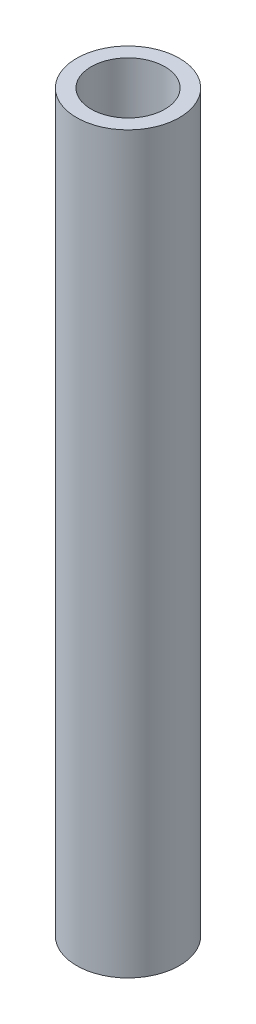
ISO-10303-21;
HEADER;
FILE_DESCRIPTION(('STEP AP214'),'2;1');
FILE_NAME('part.step','',(''),(''),'','','');
FILE_SCHEMA(('AUTOMOTIVE_DESIGN { 1 0 10303 214 1 1 1 1 }'));
ENDSEC;
DATA;
#1=APPLICATION_CONTEXT('core data for automotive mechanical design processes');
#2=APPLICATION_PROTOCOL_DEFINITION('international standard','automotive_design',2000,#1);
#3=PRODUCT_CONTEXT('',#1,'mechanical');
#4=PRODUCT('Part','Part','',(#3));
#5=PRODUCT_RELATED_PRODUCT_CATEGORY('part','',(#4));
#6=PRODUCT_DEFINITION_FORMATION('','',#4);
#7=PRODUCT_DEFINITION_CONTEXT('part definition',#1,'design');
#8=PRODUCT_DEFINITION('design','',#6,#7);
#9=PRODUCT_DEFINITION_SHAPE('','',#8);
#10=(LENGTH_UNIT() NAMED_UNIT(*) SI_UNIT(.MILLI.,.METRE.));
#11=(NAMED_UNIT(*) PLANE_ANGLE_UNIT() SI_UNIT($,.RADIAN.));
#12=(NAMED_UNIT(*) SI_UNIT($,.STERADIAN.) SOLID_ANGLE_UNIT());
#13=UNCERTAINTY_MEASURE_WITH_UNIT(LENGTH_MEASURE(1.E-05),#10,'distance_accuracy_value','');
#14=(GEOMETRIC_REPRESENTATION_CONTEXT(3) GLOBAL_UNCERTAINTY_ASSIGNED_CONTEXT((#13)) GLOBAL_UNIT_ASSIGNED_CONTEXT((#10,
#11,#12)) REPRESENTATION_CONTEXT('',''));
#15=CARTESIAN_POINT('',(0.,0.,0.));
#16=DIRECTION('',(0.,0.,1.));
#17=DIRECTION('',(1.,0.,0.));
#18=AXIS2_PLACEMENT_3D('',#15,#16,#17);
#19=CARTESIAN_POINT('',(0.,152.4,0.));
#20=DIRECTION('',(0.,1.,0.));
#21=DIRECTION('',(0.,0.,1.));
#22=AXIS2_PLACEMENT_3D('',#19,#20,#21);
#23=PLANE('',#22);
#24=CARTESIAN_POINT('',(0.,152.4,0.));
#25=DIRECTION('',(0.,1.,0.));
#26=DIRECTION('',(0.,0.,1.));
#27=AXIS2_PLACEMENT_3D('',#24,#25,#26);
#28=CIRCLE('',#27,10.668);
#29=CARTESIAN_POINT('',(0.,152.4,-10.668));
#30=VERTEX_POINT('',#29);
#31=EDGE_CURVE('E10',#30,#30,#28,.T.);
#32=ORIENTED_EDGE('',*,*,#31,.T.);
#33=EDGE_LOOP('',(#32));
#34=FACE_BOUND('',#33,.T.);
#35=CARTESIAN_POINT('',(0.,152.4,0.));
#36=DIRECTION('',(0.,1.,0.));
#37=DIRECTION('',(0.,0.,1.));
#38=AXIS2_PLACEMENT_3D('',#35,#36,#37);
#39=CIRCLE('',#38,7.6454);
#40=CARTESIAN_POINT('',(0.,152.4,-7.6454));
#41=VERTEX_POINT('',#40);
#42=EDGE_CURVE('E42',#41,#41,#39,.T.);
#43=ORIENTED_EDGE('',*,*,#42,.F.);
#44=EDGE_LOOP('',(#43));
#45=FACE_BOUND('',#44,.T.);
#46=ADVANCED_FACE('F31',(#34,#45),#23,.T.);
#47=CARTESIAN_POINT('',(0.,0.,0.));
#48=DIRECTION('',(0.,1.,0.));
#49=DIRECTION('',(0.,0.,1.));
#50=AXIS2_PLACEMENT_3D('',#47,#48,#49);
#51=PLANE('',#50);
#52=CARTESIAN_POINT('',(0.,0.,0.));
#53=DIRECTION('',(0.,1.,0.));
#54=DIRECTION('',(0.,0.,1.));
#55=AXIS2_PLACEMENT_3D('',#52,#53,#54);
#56=CIRCLE('',#55,10.668);
#57=CARTESIAN_POINT('',(0.,0.,-10.668));
#58=VERTEX_POINT('',#57);
#59=EDGE_CURVE('E35',#58,#58,#56,.T.);
#60=ORIENTED_EDGE('',*,*,#59,.F.);
#61=EDGE_LOOP('',(#60));
#62=FACE_BOUND('',#61,.T.);
#63=CARTESIAN_POINT('',(0.,0.,0.));
#64=DIRECTION('',(0.,1.,0.));
#65=DIRECTION('',(0.,0.,1.));
#66=AXIS2_PLACEMENT_3D('',#63,#64,#65);
#67=CIRCLE('',#66,7.6454);
#68=CARTESIAN_POINT('',(0.,0.,-7.6454));
#69=VERTEX_POINT('',#68);
#70=EDGE_CURVE('E44',#69,#69,#67,.T.);
#71=ORIENTED_EDGE('',*,*,#70,.T.);
#72=EDGE_LOOP('',(#71));
#73=FACE_BOUND('',#72,.T.);
#74=ADVANCED_FACE('F54',(#62,#73),#51,.F.);
#75=CARTESIAN_POINT('',(0.,152.4,0.));
#76=DIRECTION('',(0.,-1.,0.));
#77=DIRECTION('',(0.,0.,-1.));
#78=AXIS2_PLACEMENT_3D('',#75,#76,#77);
#79=CYLINDRICAL_SURFACE('',#78,10.668);
#80=CARTESIAN_POINT('',(0.,152.4,-10.668));
#81=CARTESIAN_POINT('',(0.,150.8125,-10.668));
#82=CARTESIAN_POINT('',(0.,149.225,-10.668));
#83=CARTESIAN_POINT('',(0.,146.05,-10.668));
#84=CARTESIAN_POINT('',(0.,144.4625,-10.668));
#85=CARTESIAN_POINT('',(0.,141.2875,-10.668));
#86=CARTESIAN_POINT('',(0.,139.7,-10.668));
#87=CARTESIAN_POINT('',(0.,136.525,-10.668));
#88=CARTESIAN_POINT('',(0.,134.9375,-10.668));
#89=CARTESIAN_POINT('',(0.,131.7625,-10.668));
#90=CARTESIAN_POINT('',(0.,130.175,-10.668));
#91=CARTESIAN_POINT('',(0.,127.,-10.668));
#92=CARTESIAN_POINT('',(0.,125.4125,-10.668));
#93=CARTESIAN_POINT('',(0.,122.2375,-10.668));
#94=CARTESIAN_POINT('',(0.,120.65,-10.668));
#95=CARTESIAN_POINT('',(0.,117.475,-10.668));
#96=CARTESIAN_POINT('',(0.,115.8875,-10.668));
#97=CARTESIAN_POINT('',(0.,112.7125,-10.668));
#98=CARTESIAN_POINT('',(0.,111.125,-10.668));
#99=CARTESIAN_POINT('',(0.,107.95,-10.668));
#100=CARTESIAN_POINT('',(0.,106.3625,-10.668));
#101=CARTESIAN_POINT('',(0.,103.1875,-10.668));
#102=CARTESIAN_POINT('',(0.,101.6,-10.668));
#103=CARTESIAN_POINT('',(0.,98.425,-10.668));
#104=CARTESIAN_POINT('',(0.,96.8375,-10.668));
#105=CARTESIAN_POINT('',(0.,93.6625,-10.668));
#106=CARTESIAN_POINT('',(0.,92.075,-10.668));
#107=CARTESIAN_POINT('',(0.,88.9,-10.668));
#108=CARTESIAN_POINT('',(0.,87.3125,-10.668));
#109=CARTESIAN_POINT('',(0.,84.1375,-10.668));
#110=CARTESIAN_POINT('',(0.,82.55,-10.668));
#111=CARTESIAN_POINT('',(0.,79.375,-10.668));
#112=CARTESIAN_POINT('',(0.,77.7875,-10.668));
#113=CARTESIAN_POINT('',(0.,74.6125,-10.668));
#114=CARTESIAN_POINT('',(0.,73.025,-10.668));
#115=CARTESIAN_POINT('',(0.,69.85,-10.668));
#116=CARTESIAN_POINT('',(0.,68.2625,-10.668));
#117=CARTESIAN_POINT('',(0.,65.0875,-10.668));
#118=CARTESIAN_POINT('',(0.,63.5,-10.668));
#119=CARTESIAN_POINT('',(0.,60.325,-10.668));
#120=CARTESIAN_POINT('',(0.,58.7375,-10.668));
#121=CARTESIAN_POINT('',(0.,55.5625,-10.668));
#122=CARTESIAN_POINT('',(0.,53.975,-10.668));
#123=CARTESIAN_POINT('',(0.,50.8,-10.668));
#124=CARTESIAN_POINT('',(0.,49.2125,-10.668));
#125=CARTESIAN_POINT('',(0.,46.0375,-10.668));
#126=CARTESIAN_POINT('',(0.,44.45,-10.668));
#127=CARTESIAN_POINT('',(0.,41.275,-10.668));
#128=CARTESIAN_POINT('',(0.,39.6875,-10.668));
#129=CARTESIAN_POINT('',(0.,36.5125,-10.668));
#130=CARTESIAN_POINT('',(0.,34.925,-10.668));
#131=CARTESIAN_POINT('',(0.,31.75,-10.668));
#132=CARTESIAN_POINT('',(0.,30.1625,-10.668));
#133=CARTESIAN_POINT('',(0.,26.9875,-10.668));
#134=CARTESIAN_POINT('',(0.,25.4,-10.668));
#135=CARTESIAN_POINT('',(0.,22.225,-10.668));
#136=CARTESIAN_POINT('',(0.,20.6375,-10.668));
#137=CARTESIAN_POINT('',(0.,17.4625,-10.668));
#138=CARTESIAN_POINT('',(0.,15.875,-10.668));
#139=CARTESIAN_POINT('',(0.,12.7,-10.668));
#140=CARTESIAN_POINT('',(0.,11.1125,-10.668));
#141=CARTESIAN_POINT('',(0.,7.93750000000001,-10.668));
#142=CARTESIAN_POINT('',(0.,6.35,-10.668));
#143=CARTESIAN_POINT('',(0.,3.175,-10.668));
#144=CARTESIAN_POINT('',(0.,1.5875,-10.668));
#145=CARTESIAN_POINT('',(0.,0.,-10.668));
#146=B_SPLINE_CURVE_WITH_KNOTS('',3,(#80,#81,#82,#83,#84,#85,#86,#87,#88,#89,#90,#91,#92,#93,
#94,#95,#96,#97,#98,#99,#100,#101,#102,#103,#104,#105,#106,#107,#108,#109,#110,#111,#112,#113,
#114,#115,#116,#117,#118,#119,#120,#121,#122,#123,#124,#125,#126,#127,#128,#129,#130,#131,#132,
#133,#134,#135,#136,#137,#138,#139,#140,#141,#142,#143,#144,#145),.UNSPECIFIED.,.F.,.F.,(4,2,2,
2,2,2,2,2,2,2,2,2,2,2,2,2,2,2,2,2,2,2,2,2,2,2,2,2,2,2,2,2,4),(0.,4.76249999999998,
9.52499999999998,14.2875,19.05,23.8125,28.575,33.3375,38.1,42.8625,47.625,52.3875,57.15,61.9125,
66.675,71.4375,76.2,80.9625,85.725,90.4875,95.25,100.0125,104.775,109.5375,114.3,119.0625,
123.825,128.5875,133.35,138.1125,142.875,147.6375,152.4),.UNSPECIFIED.);
#147=EDGE_CURVE('BSEAM33',#30,#58,#146,.T.);
#148=ORIENTED_EDGE('',*,*,#31,.F.);
#149=ORIENTED_EDGE('',*,*,#59,.T.);
#150=ORIENTED_EDGE('',*,*,#147,.T.);
#151=ORIENTED_EDGE('',*,*,#147,.F.);
#152=EDGE_LOOP('',(#148,#150,#149,#151));
#153=FACE_BOUND('',#152,.T.);
#154=ADVANCED_FACE('F33',(#153),#79,.T.);
#155=CARTESIAN_POINT('',(0.,152.4,0.));
#156=DIRECTION('',(0.,-1.,0.));
#157=DIRECTION('',(0.,0.,-1.));
#158=AXIS2_PLACEMENT_3D('',#155,#156,#157);
#159=CYLINDRICAL_SURFACE('',#158,7.6454);
#160=CARTESIAN_POINT('',(0.,152.4,-7.6454));
#161=CARTESIAN_POINT('',(0.,150.8125,-7.6454));
#162=CARTESIAN_POINT('',(0.,149.225,-7.6454));
#163=CARTESIAN_POINT('',(0.,146.05,-7.6454));
#164=CARTESIAN_POINT('',(0.,144.4625,-7.6454));
#165=CARTESIAN_POINT('',(0.,141.2875,-7.6454));
#166=CARTESIAN_POINT('',(0.,139.7,-7.6454));
#167=CARTESIAN_POINT('',(0.,136.525,-7.6454));
#168=CARTESIAN_POINT('',(0.,134.9375,-7.6454));
#169=CARTESIAN_POINT('',(0.,131.7625,-7.6454));
#170=CARTESIAN_POINT('',(0.,130.175,-7.6454));
#171=CARTESIAN_POINT('',(0.,127.,-7.6454));
#172=CARTESIAN_POINT('',(0.,125.4125,-7.6454));
#173=CARTESIAN_POINT('',(0.,122.2375,-7.6454));
#174=CARTESIAN_POINT('',(0.,120.65,-7.6454));
#175=CARTESIAN_POINT('',(0.,117.475,-7.6454));
#176=CARTESIAN_POINT('',(0.,115.8875,-7.6454));
#177=CARTESIAN_POINT('',(0.,112.7125,-7.6454));
#178=CARTESIAN_POINT('',(0.,111.125,-7.6454));
#179=CARTESIAN_POINT('',(0.,107.95,-7.6454));
#180=CARTESIAN_POINT('',(0.,106.3625,-7.6454));
#181=CARTESIAN_POINT('',(0.,103.1875,-7.6454));
#182=CARTESIAN_POINT('',(0.,101.6,-7.6454));
#183=CARTESIAN_POINT('',(0.,98.425,-7.6454));
#184=CARTESIAN_POINT('',(0.,96.8375,-7.6454));
#185=CARTESIAN_POINT('',(0.,93.6625,-7.6454));
#186=CARTESIAN_POINT('',(0.,92.075,-7.6454));
#187=CARTESIAN_POINT('',(0.,88.9,-7.6454));
#188=CARTESIAN_POINT('',(0.,87.3125,-7.6454));
#189=CARTESIAN_POINT('',(0.,84.1375,-7.6454));
#190=CARTESIAN_POINT('',(0.,82.55,-7.6454));
#191=CARTESIAN_POINT('',(0.,79.375,-7.6454));
#192=CARTESIAN_POINT('',(0.,77.7875,-7.6454));
#193=CARTESIAN_POINT('',(0.,74.6125,-7.6454));
#194=CARTESIAN_POINT('',(0.,73.025,-7.6454));
#195=CARTESIAN_POINT('',(0.,69.85,-7.6454));
#196=CARTESIAN_POINT('',(0.,68.2625,-7.6454));
#197=CARTESIAN_POINT('',(0.,65.0875,-7.6454));
#198=CARTESIAN_POINT('',(0.,63.5,-7.6454));
#199=CARTESIAN_POINT('',(0.,60.325,-7.6454));
#200=CARTESIAN_POINT('',(0.,58.7375,-7.6454));
#201=CARTESIAN_POINT('',(0.,55.5625,-7.6454));
#202=CARTESIAN_POINT('',(0.,53.975,-7.6454));
#203=CARTESIAN_POINT('',(0.,50.8,-7.6454));
#204=CARTESIAN_POINT('',(0.,49.2125,-7.6454));
#205=CARTESIAN_POINT('',(0.,46.0375,-7.6454));
#206=CARTESIAN_POINT('',(0.,44.45,-7.6454));
#207=CARTESIAN_POINT('',(0.,41.275,-7.6454));
#208=CARTESIAN_POINT('',(0.,39.6875,-7.6454));
#209=CARTESIAN_POINT('',(0.,36.5125,-7.6454));
#210=CARTESIAN_POINT('',(0.,34.925,-7.6454));
#211=CARTESIAN_POINT('',(0.,31.75,-7.6454));
#212=CARTESIAN_POINT('',(0.,30.1625,-7.6454));
#213=CARTESIAN_POINT('',(0.,26.9875,-7.6454));
#214=CARTESIAN_POINT('',(0.,25.4,-7.6454));
#215=CARTESIAN_POINT('',(0.,22.225,-7.6454));
#216=CARTESIAN_POINT('',(0.,20.6375,-7.6454));
#217=CARTESIAN_POINT('',(0.,17.4625,-7.6454));
#218=CARTESIAN_POINT('',(0.,15.875,-7.6454));
#219=CARTESIAN_POINT('',(0.,12.7,-7.6454));
#220=CARTESIAN_POINT('',(0.,11.1125,-7.6454));
#221=CARTESIAN_POINT('',(0.,7.93750000000001,-7.6454));
#222=CARTESIAN_POINT('',(0.,6.35,-7.6454));
#223=CARTESIAN_POINT('',(0.,3.175,-7.6454));
#224=CARTESIAN_POINT('',(0.,1.5875,-7.6454));
#225=CARTESIAN_POINT('',(0.,0.,-7.6454));
#226=B_SPLINE_CURVE_WITH_KNOTS('',3,(#160,#161,#162,#163,#164,#165,#166,#167,#168,#169,#170,
#171,#172,#173,#174,#175,#176,#177,#178,#179,#180,#181,#182,#183,#184,#185,#186,#187,#188,#189,
#190,#191,#192,#193,#194,#195,#196,#197,#198,#199,#200,#201,#202,#203,#204,#205,#206,#207,#208,
#209,#210,#211,#212,#213,#214,#215,#216,#217,#218,#219,#220,#221,#222,#223,#224,#225),
.UNSPECIFIED.,.F.,.F.,(4,2,2,2,2,2,2,2,2,2,2,2,2,2,2,2,2,2,2,2,2,2,2,2,2,2,2,2,2,2,2,2,4),(0.,
4.76249999999998,9.52499999999998,14.2875,19.05,23.8125,28.575,33.3375,38.1,42.8625,47.625,
52.3875,57.15,61.9125,66.675,71.4375,76.2,80.9625,85.725,90.4875,95.25,100.0125,104.775,
109.5375,114.3,119.0625,123.825,128.5875,133.35,138.1125,142.875,147.6375,152.4),.UNSPECIFIED.);
#227=EDGE_CURVE('BSEAM50',#41,#69,#226,.T.);
#228=ORIENTED_EDGE('',*,*,#42,.T.);
#229=ORIENTED_EDGE('',*,*,#70,.F.);
#230=ORIENTED_EDGE('',*,*,#227,.T.);
#231=ORIENTED_EDGE('',*,*,#227,.F.);
#232=EDGE_LOOP('',(#228,#230,#229,#231));
#233=FACE_BOUND('',#232,.T.);
#234=ADVANCED_FACE('F50',(#233),#159,.F.);
#235=CLOSED_SHELL('',(#46,#74,#154,#234));
#236=MANIFOLD_SOLID_BREP('B2',#235);
#237=ADVANCED_BREP_SHAPE_REPRESENTATION('',(#18,#236),#14);
#238=SHAPE_DEFINITION_REPRESENTATION(#9,#237);
ENDSEC;
END-ISO-10303-21;
